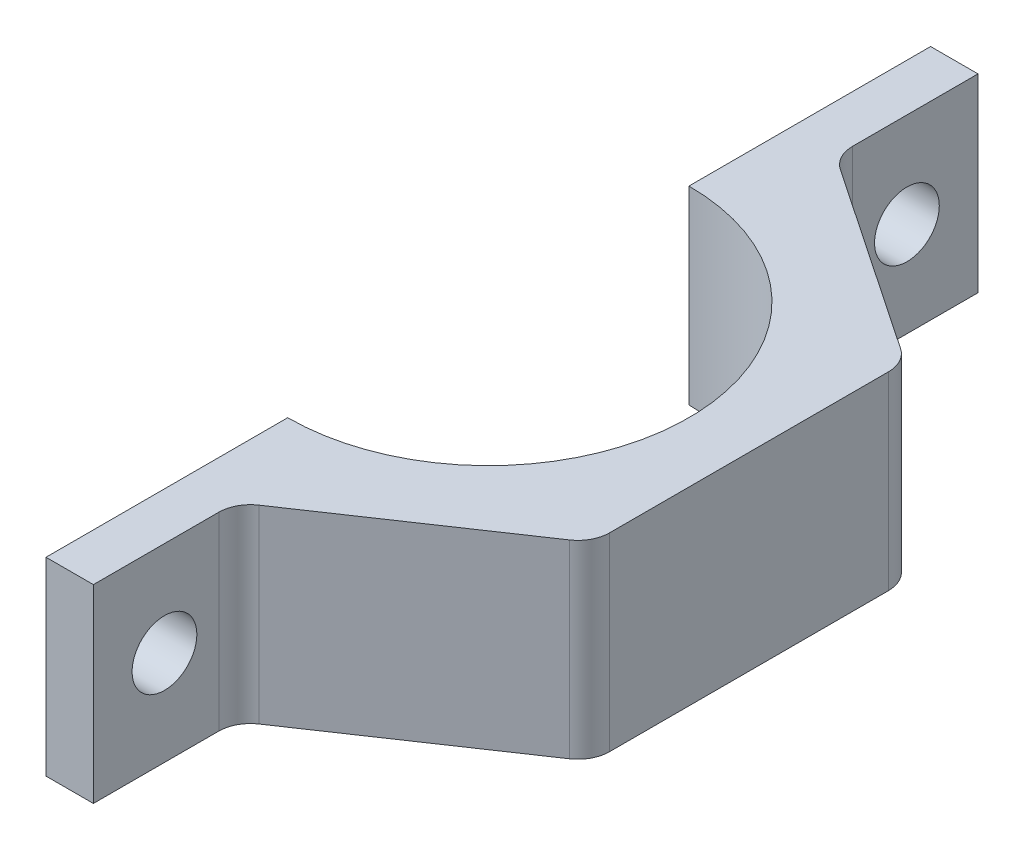
ISO-10303-21;
HEADER;
FILE_DESCRIPTION(('STEP AP214'),'2;1');
FILE_NAME('part.step','',(''),(''),'','','');
FILE_SCHEMA(('AUTOMOTIVE_DESIGN { 1 0 10303 214 1 1 1 1 }'));
ENDSEC;
DATA;
#1=APPLICATION_CONTEXT('core data for automotive mechanical design processes');
#2=APPLICATION_PROTOCOL_DEFINITION('international standard','automotive_design',2000,#1);
#3=PRODUCT_CONTEXT('',#1,'mechanical');
#4=PRODUCT('Part','Part','',(#3));
#5=PRODUCT_RELATED_PRODUCT_CATEGORY('part','',(#4));
#6=PRODUCT_DEFINITION_FORMATION('','',#4);
#7=PRODUCT_DEFINITION_CONTEXT('part definition',#1,'design');
#8=PRODUCT_DEFINITION('design','',#6,#7);
#9=PRODUCT_DEFINITION_SHAPE('','',#8);
#10=(LENGTH_UNIT() NAMED_UNIT(*) SI_UNIT(.MILLI.,.METRE.));
#11=(NAMED_UNIT(*) PLANE_ANGLE_UNIT() SI_UNIT($,.RADIAN.));
#12=(NAMED_UNIT(*) SI_UNIT($,.STERADIAN.) SOLID_ANGLE_UNIT());
#13=UNCERTAINTY_MEASURE_WITH_UNIT(LENGTH_MEASURE(1.E-05),#10,'distance_accuracy_value','');
#14=(GEOMETRIC_REPRESENTATION_CONTEXT(3) GLOBAL_UNCERTAINTY_ASSIGNED_CONTEXT((#13)) GLOBAL_UNIT_ASSIGNED_CONTEXT((#10,
#11,#12)) REPRESENTATION_CONTEXT('',''));
#15=CARTESIAN_POINT('',(0.,0.,0.));
#16=DIRECTION('',(0.,0.,1.));
#17=DIRECTION('',(1.,0.,0.));
#18=AXIS2_PLACEMENT_3D('',#15,#16,#17);
#19=CARTESIAN_POINT('',(0.,12.,0.));
#20=DIRECTION('',(0.,-1.,0.));
#21=DIRECTION('',(0.,0.,-1.));
#22=AXIS2_PLACEMENT_3D('',#19,#20,#21);
#23=CYLINDRICAL_SURFACE('',#22,12.7);
#24=CARTESIAN_POINT('',(0.,0.,0.));
#25=DIRECTION('',(0.,1.,0.));
#26=DIRECTION('',(0.,0.,1.));
#27=AXIS2_PLACEMENT_3D('',#24,#25,#26);
#28=CIRCLE('',#27,12.7);
#29=CARTESIAN_POINT('',(0.,0.,12.7));
#30=VERTEX_POINT('',#29);
#31=CARTESIAN_POINT('',(0.,0.,-12.7));
#32=VERTEX_POINT('',#31);
#33=EDGE_CURVE('E165',#30,#32,#28,.T.);
#34=ORIENTED_EDGE('',*,*,#33,.F.);
#35=DIRECTION('',(0.,-1.,0.));
#36=VECTOR('',#35,1.);
#37=CARTESIAN_POINT('',(0.,12.,12.7));
#38=LINE('',#37,#36);
#39=CARTESIAN_POINT('',(0.,12.,12.7));
#40=VERTEX_POINT('',#39);
#41=EDGE_CURVE('E11',#40,#30,#38,.T.);
#42=ORIENTED_EDGE('',*,*,#41,.F.);
#43=CARTESIAN_POINT('',(0.,12.,0.));
#44=DIRECTION('',(0.,1.,0.));
#45=DIRECTION('',(0.,0.,1.));
#46=AXIS2_PLACEMENT_3D('',#43,#44,#45);
#47=CIRCLE('',#46,12.7);
#48=CARTESIAN_POINT('',(0.,12.,-12.7));
#49=VERTEX_POINT('',#48);
#50=EDGE_CURVE('E200',#40,#49,#47,.T.);
#51=ORIENTED_EDGE('',*,*,#50,.T.);
#52=DIRECTION('',(0.,-1.,0.));
#53=VECTOR('',#52,1.);
#54=CARTESIAN_POINT('',(0.,12.,-12.7));
#55=LINE('',#54,#53);
#56=EDGE_CURVE('E104',#49,#32,#55,.T.);
#57=ORIENTED_EDGE('',*,*,#56,.T.);
#58=EDGE_LOOP('',(#34,#42,#51,#57));
#59=FACE_BOUND('',#58,.T.);
#60=ADVANCED_FACE('F35',(#59),#23,.F.);
#61=CARTESIAN_POINT('',(0.,12.,0.));
#62=DIRECTION('',(1.,0.,0.));
#63=DIRECTION('',(0.,0.,-1.));
#64=AXIS2_PLACEMENT_3D('',#61,#62,#63);
#65=PLANE('',#64);
#66=CARTESIAN_POINT('',(0.,6.,23.5));
#67=DIRECTION('',(1.,0.,0.));
#68=DIRECTION('',(0.,0.,-1.));
#69=AXIS2_PLACEMENT_3D('',#66,#67,#68);
#70=CIRCLE('',#69,2.05);
#71=CARTESIAN_POINT('',(0.,6.,21.45));
#72=VERTEX_POINT('',#71);
#73=EDGE_CURVE('E169',#72,#72,#70,.T.);
#74=ORIENTED_EDGE('',*,*,#73,.T.);
#75=EDGE_LOOP('',(#74));
#76=FACE_BOUND('',#75,.T.);
#77=DIRECTION('',(0.,0.,1.));
#78=VECTOR('',#77,1.);
#79=CARTESIAN_POINT('',(0.,0.,0.));
#80=LINE('',#79,#78);
#81=CARTESIAN_POINT('',(0.,0.,28.));
#82=VERTEX_POINT('',#81);
#83=EDGE_CURVE('E168',#30,#82,#80,.T.);
#84=ORIENTED_EDGE('',*,*,#83,.T.);
#85=DIRECTION('',(0.,-1.,0.));
#86=VECTOR('',#85,1.);
#87=CARTESIAN_POINT('',(0.,12.,28.));
#88=LINE('',#87,#86);
#89=CARTESIAN_POINT('',(0.,12.,28.));
#90=VERTEX_POINT('',#89);
#91=EDGE_CURVE('E44',#90,#82,#88,.T.);
#92=ORIENTED_EDGE('',*,*,#91,.F.);
#93=DIRECTION('',(0.,0.,1.));
#94=VECTOR('',#93,1.);
#95=CARTESIAN_POINT('',(0.,12.,0.));
#96=LINE('',#95,#94);
#97=EDGE_CURVE('E270',#40,#90,#96,.T.);
#98=ORIENTED_EDGE('',*,*,#97,.F.);
#99=ORIENTED_EDGE('',*,*,#41,.T.);
#100=EDGE_LOOP('',(#84,#92,#98,#99));
#101=FACE_BOUND('',#100,.T.);
#102=ADVANCED_FACE('F275',(#76,#101),#65,.F.);
#103=CARTESIAN_POINT('',(0.,12.,28.));
#104=DIRECTION('',(0.,0.,-1.));
#105=DIRECTION('',(-1.,0.,0.));
#106=AXIS2_PLACEMENT_3D('',#103,#104,#105);
#107=PLANE('',#106);
#108=DIRECTION('',(1.,0.,0.));
#109=VECTOR('',#108,1.);
#110=CARTESIAN_POINT('',(0.,0.,28.));
#111=LINE('',#110,#109);
#112=CARTESIAN_POINT('',(2.99999999999999,0.,28.));
#113=VERTEX_POINT('',#112);
#114=EDGE_CURVE('E171',#82,#113,#111,.T.);
#115=ORIENTED_EDGE('',*,*,#114,.T.);
#116=DIRECTION('',(0.,-1.,0.));
#117=VECTOR('',#116,1.);
#118=CARTESIAN_POINT('',(2.99999999999999,12.,28.));
#119=LINE('',#118,#117);
#120=CARTESIAN_POINT('',(2.99999999999999,12.,28.));
#121=VERTEX_POINT('',#120);
#122=EDGE_CURVE('E220',#121,#113,#119,.T.);
#123=ORIENTED_EDGE('',*,*,#122,.F.);
#124=DIRECTION('',(1.,0.,0.));
#125=VECTOR('',#124,1.);
#126=CARTESIAN_POINT('',(0.,12.,28.));
#127=LINE('',#126,#125);
#128=EDGE_CURVE('E230',#90,#121,#127,.T.);
#129=ORIENTED_EDGE('',*,*,#128,.F.);
#130=ORIENTED_EDGE('',*,*,#91,.T.);
#131=EDGE_LOOP('',(#115,#123,#129,#130));
#132=FACE_BOUND('',#131,.T.);
#133=ADVANCED_FACE('F228',(#132),#107,.F.);
#134=CARTESIAN_POINT('',(2.99999999999999,12.,0.));
#135=DIRECTION('',(-1.,0.,0.));
#136=DIRECTION('',(0.,0.,1.));
#137=AXIS2_PLACEMENT_3D('',#134,#135,#136);
#138=PLANE('',#137);
#139=CARTESIAN_POINT('',(3.,6.,23.5));
#140=DIRECTION('',(1.,0.,0.));
#141=DIRECTION('',(0.,0.,1.));
#142=AXIS2_PLACEMENT_3D('',#139,#140,#141);
#143=CIRCLE('',#142,2.05);
#144=CARTESIAN_POINT('',(3.,6.,25.55));
#145=VERTEX_POINT('',#144);
#146=EDGE_CURVE('E339',#145,#145,#143,.T.);
#147=ORIENTED_EDGE('',*,*,#146,.F.);
#148=EDGE_LOOP('',(#147));
#149=FACE_BOUND('',#148,.T.);
#150=DIRECTION('',(0.,0.,-1.));
#151=VECTOR('',#150,1.);
#152=CARTESIAN_POINT('',(2.99999999999999,0.,0.));
#153=LINE('',#152,#151);
#154=CARTESIAN_POINT('',(2.99999999999999,0.,20.0629290839179));
#155=VERTEX_POINT('',#154);
#156=EDGE_CURVE('E173',#113,#155,#153,.T.);
#157=ORIENTED_EDGE('',*,*,#156,.T.);
#158=DIRECTION('',(0.,-1.,0.));
#159=VECTOR('',#158,1.);
#160=CARTESIAN_POINT('',(2.99999999999999,12.,20.0629290839179));
#161=LINE('',#160,#159);
#162=CARTESIAN_POINT('',(2.99999999999999,12.,20.0629290839179));
#163=VERTEX_POINT('',#162);
#164=EDGE_CURVE('E217',#163,#155,#161,.T.);
#165=ORIENTED_EDGE('',*,*,#164,.F.);
#166=DIRECTION('',(0.,0.,-1.));
#167=VECTOR('',#166,1.);
#168=CARTESIAN_POINT('',(2.99999999999999,12.,0.));
#169=LINE('',#168,#167);
#170=EDGE_CURVE('E249',#121,#163,#169,.T.);
#171=ORIENTED_EDGE('',*,*,#170,.F.);
#172=ORIENTED_EDGE('',*,*,#122,.T.);
#173=EDGE_LOOP('',(#157,#165,#171,#172));
#174=FACE_BOUND('',#173,.T.);
#175=ADVANCED_FACE('F239',(#149,#174),#138,.F.);
#176=CARTESIAN_POINT('',(4.99999999999999,12.,20.0629290839179));
#177=DIRECTION('',(0.,-1.,0.));
#178=DIRECTION('',(0.,0.,-1.));
#179=AXIS2_PLACEMENT_3D('',#176,#177,#178);
#180=CYLINDRICAL_SURFACE('',#179,2.);
#181=CARTESIAN_POINT('',(4.99999999999999,0.,20.0629290839179));
#182=DIRECTION('',(0.,1.,0.));
#183=DIRECTION('',(0.,0.,1.));
#184=AXIS2_PLACEMENT_3D('',#181,#182,#183);
#185=CIRCLE('',#184,2.);
#186=CARTESIAN_POINT('',(3.88098110704418,0.,18.4052811366118));
#187=VERTEX_POINT('',#186);
#188=EDGE_CURVE('E175',#155,#187,#185,.F.);
#189=ORIENTED_EDGE('',*,*,#188,.T.);
#190=DIRECTION('',(0.,-1.,0.));
#191=VECTOR('',#190,1.);
#192=CARTESIAN_POINT('',(3.88098110704418,12.,18.4052811366118));
#193=LINE('',#192,#191);
#194=CARTESIAN_POINT('',(3.88098110704418,12.,18.4052811366118));
#195=VERTEX_POINT('',#194);
#196=EDGE_CURVE('E215',#195,#187,#193,.T.);
#197=ORIENTED_EDGE('',*,*,#196,.F.);
#198=CARTESIAN_POINT('',(4.99999999999999,12.,20.0629290839179));
#199=DIRECTION('',(0.,1.,0.));
#200=DIRECTION('',(0.,0.,1.));
#201=AXIS2_PLACEMENT_3D('',#198,#199,#200);
#202=CIRCLE('',#201,2.);
#203=EDGE_CURVE('E245',#163,#195,#202,.F.);
#204=ORIENTED_EDGE('',*,*,#203,.F.);
#205=ORIENTED_EDGE('',*,*,#164,.T.);
#206=EDGE_LOOP('',(#189,#197,#204,#205));
#207=FACE_BOUND('',#206,.T.);
#208=ADVANCED_FACE('F243',(#207),#180,.F.);
#209=CARTESIAN_POINT('',(9.75011447389231,12.,14.4432389349163));
#210=DIRECTION('',(0.559509446477911,0.,0.82882397365302));
#211=DIRECTION('',(0.82882397365302,0.,-0.559509446477911));
#212=AXIS2_PLACEMENT_3D('',#209,#210,#211);
#213=PLANE('',#212);
#214=DIRECTION('',(-0.82882397365302,0.,0.559509446477911));
#215=VECTOR('',#214,1.);
#216=CARTESIAN_POINT('',(9.75011447389231,0.,14.4432389349163));
#217=LINE('',#216,#215);
#218=CARTESIAN_POINT('',(15.6192478407404,0.,10.4811967332208));
#219=VERTEX_POINT('',#218);
#220=EDGE_CURVE('E178',#219,#187,#217,.T.);
#221=ORIENTED_EDGE('',*,*,#220,.F.);
#222=DIRECTION('',(0.,-1.,0.));
#223=VECTOR('',#222,1.);
#224=CARTESIAN_POINT('',(15.6192478407404,12.,10.4811967332208));
#225=LINE('',#224,#223);
#226=CARTESIAN_POINT('',(15.6192478407404,12.,10.4811967332208));
#227=VERTEX_POINT('',#226);
#228=EDGE_CURVE('E213',#227,#219,#225,.T.);
#229=ORIENTED_EDGE('',*,*,#228,.F.);
#230=DIRECTION('',(-0.82882397365302,0.,0.559509446477911));
#231=VECTOR('',#230,1.);
#232=CARTESIAN_POINT('',(9.75011447389231,12.,14.4432389349163));
#233=LINE('',#232,#231);
#234=EDGE_CURVE('E248',#227,#195,#233,.T.);
#235=ORIENTED_EDGE('',*,*,#234,.T.);
#236=ORIENTED_EDGE('',*,*,#196,.T.);
#237=EDGE_LOOP('',(#221,#229,#235,#236));
#238=FACE_BOUND('',#237,.T.);
#239=ADVANCED_FACE('F290',(#238),#213,.T.);
#240=CARTESIAN_POINT('',(14.5002289477846,12.,8.82354878591476));
#241=DIRECTION('',(0.,-1.,0.));
#242=DIRECTION('',(0.,0.,-1.));
#243=AXIS2_PLACEMENT_3D('',#240,#241,#242);
#244=CYLINDRICAL_SURFACE('',#243,2.);
#245=CARTESIAN_POINT('',(14.5002289477846,0.,8.82354878591476));
#246=DIRECTION('',(0.,1.,0.));
#247=DIRECTION('',(0.,0.,1.));
#248=AXIS2_PLACEMENT_3D('',#245,#246,#247);
#249=CIRCLE('',#248,2.);
#250=CARTESIAN_POINT('',(16.5002289477846,0.,8.82354878591475));
#251=VERTEX_POINT('',#250);
#252=EDGE_CURVE('E181',#251,#219,#249,.F.);
#253=ORIENTED_EDGE('',*,*,#252,.F.);
#254=DIRECTION('',(0.,-1.,0.));
#255=VECTOR('',#254,1.);
#256=CARTESIAN_POINT('',(16.5002289477846,12.,8.82354878591475));
#257=LINE('',#256,#255);
#258=CARTESIAN_POINT('',(16.5002289477846,12.,8.82354878591475));
#259=VERTEX_POINT('',#258);
#260=EDGE_CURVE('E211',#259,#251,#257,.T.);
#261=ORIENTED_EDGE('',*,*,#260,.F.);
#262=CARTESIAN_POINT('',(14.5002289477846,12.,8.82354878591476));
#263=DIRECTION('',(0.,1.,0.));
#264=DIRECTION('',(0.,0.,1.));
#265=AXIS2_PLACEMENT_3D('',#262,#263,#264);
#266=CIRCLE('',#265,2.);
#267=EDGE_CURVE('E251',#259,#227,#266,.F.);
#268=ORIENTED_EDGE('',*,*,#267,.T.);
#269=ORIENTED_EDGE('',*,*,#228,.T.);
#270=EDGE_LOOP('',(#253,#261,#268,#269));
#271=FACE_BOUND('',#270,.T.);
#272=ADVANCED_FACE('F293',(#271),#244,.T.);
#273=CARTESIAN_POINT('',(16.5002289477846,12.,0.));
#274=DIRECTION('',(1.,0.,0.));
#275=DIRECTION('',(0.,0.,-1.));
#276=AXIS2_PLACEMENT_3D('',#273,#274,#275);
#277=PLANE('',#276);
#278=DIRECTION('',(0.,0.,1.));
#279=VECTOR('',#278,1.);
#280=CARTESIAN_POINT('',(16.5002289477846,0.,0.));
#281=LINE('',#280,#279);
#282=CARTESIAN_POINT('',(16.5002289477846,0.,-8.82354878591475));
#283=VERTEX_POINT('',#282);
#284=EDGE_CURVE('E184',#283,#251,#281,.T.);
#285=ORIENTED_EDGE('',*,*,#284,.F.);
#286=DIRECTION('',(0.,-1.,0.));
#287=VECTOR('',#286,1.);
#288=CARTESIAN_POINT('',(16.5002289477846,12.,-8.82354878591475));
#289=LINE('',#288,#287);
#290=CARTESIAN_POINT('',(16.5002289477846,12.,-8.82354878591475));
#291=VERTEX_POINT('',#290);
#292=EDGE_CURVE('E209',#291,#283,#289,.T.);
#293=ORIENTED_EDGE('',*,*,#292,.F.);
#294=DIRECTION('',(0.,0.,1.));
#295=VECTOR('',#294,1.);
#296=CARTESIAN_POINT('',(16.5002289477846,12.,0.));
#297=LINE('',#296,#295);
#298=EDGE_CURVE('E258',#291,#259,#297,.T.);
#299=ORIENTED_EDGE('',*,*,#298,.T.);
#300=ORIENTED_EDGE('',*,*,#260,.T.);
#301=EDGE_LOOP('',(#285,#293,#299,#300));
#302=FACE_BOUND('',#301,.T.);
#303=ADVANCED_FACE('F297',(#302),#277,.T.);
#304=CARTESIAN_POINT('',(14.5002289477846,12.,-8.82354878591476));
#305=DIRECTION('',(0.,-1.,0.));
#306=DIRECTION('',(0.,0.,-1.));
#307=AXIS2_PLACEMENT_3D('',#304,#305,#306);
#308=CYLINDRICAL_SURFACE('',#307,2.);
#309=CARTESIAN_POINT('',(14.5002289477846,0.,-8.82354878591476));
#310=DIRECTION('',(0.,1.,0.));
#311=DIRECTION('',(0.,0.,1.));
#312=AXIS2_PLACEMENT_3D('',#309,#310,#311);
#313=CIRCLE('',#312,2.);
#314=CARTESIAN_POINT('',(15.6192478407404,0.,-10.4811967332208));
#315=VERTEX_POINT('',#314);
#316=EDGE_CURVE('E187',#283,#315,#313,.T.);
#317=ORIENTED_EDGE('',*,*,#316,.T.);
#318=DIRECTION('',(0.,-1.,0.));
#319=VECTOR('',#318,1.);
#320=CARTESIAN_POINT('',(15.6192478407404,12.,-10.4811967332208));
#321=LINE('',#320,#319);
#322=CARTESIAN_POINT('',(15.6192478407404,12.,-10.4811967332208));
#323=VERTEX_POINT('',#322);
#324=EDGE_CURVE('E206',#323,#315,#321,.T.);
#325=ORIENTED_EDGE('',*,*,#324,.F.);
#326=CARTESIAN_POINT('',(14.5002289477846,12.,-8.82354878591476));
#327=DIRECTION('',(0.,1.,0.));
#328=DIRECTION('',(0.,0.,1.));
#329=AXIS2_PLACEMENT_3D('',#326,#327,#328);
#330=CIRCLE('',#329,2.);
#331=EDGE_CURVE('E261',#291,#323,#330,.T.);
#332=ORIENTED_EDGE('',*,*,#331,.F.);
#333=ORIENTED_EDGE('',*,*,#292,.T.);
#334=EDGE_LOOP('',(#317,#325,#332,#333));
#335=FACE_BOUND('',#334,.T.);
#336=ADVANCED_FACE('F301',(#335),#308,.T.);
#337=CARTESIAN_POINT('',(9.75011447389231,12.,-14.4432389349163));
#338=DIRECTION('',(-0.559509446477911,0.,0.82882397365302));
#339=DIRECTION('',(0.82882397365302,0.,0.559509446477911));
#340=AXIS2_PLACEMENT_3D('',#337,#338,#339);
#341=PLANE('',#340);
#342=DIRECTION('',(-0.82882397365302,0.,-0.559509446477911));
#343=VECTOR('',#342,1.);
#344=CARTESIAN_POINT('',(9.75011447389231,0.,-14.4432389349163));
#345=LINE('',#344,#343);
#346=CARTESIAN_POINT('',(3.88098110704418,0.,-18.4052811366118));
#347=VERTEX_POINT('',#346);
#348=EDGE_CURVE('E189',#315,#347,#345,.T.);
#349=ORIENTED_EDGE('',*,*,#348,.T.);
#350=DIRECTION('',(0.,-1.,0.));
#351=VECTOR('',#350,1.);
#352=CARTESIAN_POINT('',(3.88098110704418,12.,-18.4052811366118));
#353=LINE('',#352,#351);
#354=CARTESIAN_POINT('',(3.88098110704418,12.,-18.4052811366118));
#355=VERTEX_POINT('',#354);
#356=EDGE_CURVE('E204',#355,#347,#353,.T.);
#357=ORIENTED_EDGE('',*,*,#356,.F.);
#358=DIRECTION('',(-0.82882397365302,0.,-0.559509446477911));
#359=VECTOR('',#358,1.);
#360=CARTESIAN_POINT('',(9.75011447389231,12.,-14.4432389349163));
#361=LINE('',#360,#359);
#362=EDGE_CURVE('E263',#323,#355,#361,.T.);
#363=ORIENTED_EDGE('',*,*,#362,.F.);
#364=ORIENTED_EDGE('',*,*,#324,.T.);
#365=EDGE_LOOP('',(#349,#357,#363,#364));
#366=FACE_BOUND('',#365,.T.);
#367=ADVANCED_FACE('F305',(#366),#341,.F.);
#368=CARTESIAN_POINT('',(4.99999999999999,12.,-20.0629290839179));
#369=DIRECTION('',(0.,-1.,0.));
#370=DIRECTION('',(0.,0.,-1.));
#371=AXIS2_PLACEMENT_3D('',#368,#369,#370);
#372=CYLINDRICAL_SURFACE('',#371,2.);
#373=CARTESIAN_POINT('',(4.99999999999999,0.,-20.0629290839179));
#374=DIRECTION('',(0.,1.,0.));
#375=DIRECTION('',(0.,0.,1.));
#376=AXIS2_PLACEMENT_3D('',#373,#374,#375);
#377=CIRCLE('',#376,2.);
#378=CARTESIAN_POINT('',(2.99999999999999,0.,-20.0629290839179));
#379=VERTEX_POINT('',#378);
#380=EDGE_CURVE('E192',#379,#347,#377,.T.);
#381=ORIENTED_EDGE('',*,*,#380,.F.);
#382=DIRECTION('',(0.,-1.,0.));
#383=VECTOR('',#382,1.);
#384=CARTESIAN_POINT('',(2.99999999999999,12.,-20.0629290839179));
#385=LINE('',#384,#383);
#386=CARTESIAN_POINT('',(2.99999999999999,12.,-20.0629290839179));
#387=VERTEX_POINT('',#386);
#388=EDGE_CURVE('E152',#387,#379,#385,.T.);
#389=ORIENTED_EDGE('',*,*,#388,.F.);
#390=CARTESIAN_POINT('',(4.99999999999999,12.,-20.0629290839179));
#391=DIRECTION('',(0.,1.,0.));
#392=DIRECTION('',(0.,0.,1.));
#393=AXIS2_PLACEMENT_3D('',#390,#391,#392);
#394=CIRCLE('',#393,2.);
#395=EDGE_CURVE('E158',#387,#355,#394,.T.);
#396=ORIENTED_EDGE('',*,*,#395,.T.);
#397=ORIENTED_EDGE('',*,*,#356,.T.);
#398=EDGE_LOOP('',(#381,#389,#396,#397));
#399=FACE_BOUND('',#398,.T.);
#400=ADVANCED_FACE('F266',(#399),#372,.F.);
#401=CARTESIAN_POINT('',(2.99999999999999,12.,0.));
#402=DIRECTION('',(1.,0.,0.));
#403=DIRECTION('',(0.,0.,-1.));
#404=AXIS2_PLACEMENT_3D('',#401,#402,#403);
#405=PLANE('',#404);
#406=CARTESIAN_POINT('',(2.99999999999999,6.,-23.5));
#407=DIRECTION('',(1.,0.,0.));
#408=DIRECTION('',(0.,0.,-1.));
#409=AXIS2_PLACEMENT_3D('',#406,#407,#408);
#410=CIRCLE('',#409,2.05);
#411=CARTESIAN_POINT('',(2.99999999999999,6.,-25.55));
#412=VERTEX_POINT('',#411);
#413=EDGE_CURVE('E336',#412,#412,#410,.T.);
#414=ORIENTED_EDGE('',*,*,#413,.F.);
#415=EDGE_LOOP('',(#414));
#416=FACE_BOUND('',#415,.T.);
#417=DIRECTION('',(0.,0.,1.));
#418=VECTOR('',#417,1.);
#419=CARTESIAN_POINT('',(2.99999999999999,0.,0.));
#420=LINE('',#419,#418);
#421=CARTESIAN_POINT('',(2.99999999999999,0.,-28.));
#422=VERTEX_POINT('',#421);
#423=EDGE_CURVE('E147',#422,#379,#420,.T.);
#424=ORIENTED_EDGE('',*,*,#423,.F.);
#425=DIRECTION('',(0.,-1.,0.));
#426=VECTOR('',#425,1.);
#427=CARTESIAN_POINT('',(2.99999999999999,12.,-28.));
#428=LINE('',#427,#426);
#429=CARTESIAN_POINT('',(2.99999999999999,12.,-28.));
#430=VERTEX_POINT('',#429);
#431=EDGE_CURVE('E142',#430,#422,#428,.T.);
#432=ORIENTED_EDGE('',*,*,#431,.F.);
#433=DIRECTION('',(0.,0.,1.));
#434=VECTOR('',#433,1.);
#435=CARTESIAN_POINT('',(2.99999999999999,12.,0.));
#436=LINE('',#435,#434);
#437=EDGE_CURVE('E145',#430,#387,#436,.T.);
#438=ORIENTED_EDGE('',*,*,#437,.T.);
#439=ORIENTED_EDGE('',*,*,#388,.T.);
#440=EDGE_LOOP('',(#424,#432,#438,#439));
#441=FACE_BOUND('',#440,.T.);
#442=ADVANCED_FACE('F144',(#416,#441),#405,.T.);
#443=CARTESIAN_POINT('',(0.,12.,-28.));
#444=DIRECTION('',(0.,0.,-1.));
#445=DIRECTION('',(-1.,0.,0.));
#446=AXIS2_PLACEMENT_3D('',#443,#444,#445);
#447=PLANE('',#446);
#448=DIRECTION('',(1.,0.,0.));
#449=VECTOR('',#448,1.);
#450=CARTESIAN_POINT('',(0.,0.,-28.));
#451=LINE('',#450,#449);
#452=CARTESIAN_POINT('',(0.,0.,-28.));
#453=VERTEX_POINT('',#452);
#454=EDGE_CURVE('E196',#453,#422,#451,.T.);
#455=ORIENTED_EDGE('',*,*,#454,.F.);
#456=DIRECTION('',(0.,-1.,0.));
#457=VECTOR('',#456,1.);
#458=CARTESIAN_POINT('',(0.,12.,-28.));
#459=LINE('',#458,#457);
#460=CARTESIAN_POINT('',(0.,12.,-28.));
#461=VERTEX_POINT('',#460);
#462=EDGE_CURVE('E97',#461,#453,#459,.T.);
#463=ORIENTED_EDGE('',*,*,#462,.F.);
#464=DIRECTION('',(1.,0.,0.));
#465=VECTOR('',#464,1.);
#466=CARTESIAN_POINT('',(0.,12.,-28.));
#467=LINE('',#466,#465);
#468=EDGE_CURVE('E156',#461,#430,#467,.T.);
#469=ORIENTED_EDGE('',*,*,#468,.T.);
#470=ORIENTED_EDGE('',*,*,#431,.T.);
#471=EDGE_LOOP('',(#455,#463,#469,#470));
#472=FACE_BOUND('',#471,.T.);
#473=ADVANCED_FACE('F160',(#472),#447,.T.);
#474=CARTESIAN_POINT('',(0.,12.,0.));
#475=DIRECTION('',(1.,0.,0.));
#476=DIRECTION('',(0.,0.,-1.));
#477=AXIS2_PLACEMENT_3D('',#474,#475,#476);
#478=PLANE('',#477);
#479=CARTESIAN_POINT('',(0.,6.,-23.5));
#480=DIRECTION('',(1.,0.,0.));
#481=DIRECTION('',(0.,0.,-1.));
#482=AXIS2_PLACEMENT_3D('',#479,#480,#481);
#483=CIRCLE('',#482,2.05);
#484=CARTESIAN_POINT('',(0.,6.,-25.55));
#485=VERTEX_POINT('',#484);
#486=EDGE_CURVE('E38',#485,#485,#483,.T.);
#487=ORIENTED_EDGE('',*,*,#486,.T.);
#488=EDGE_LOOP('',(#487));
#489=FACE_BOUND('',#488,.T.);
#490=DIRECTION('',(0.,0.,1.));
#491=VECTOR('',#490,1.);
#492=CARTESIAN_POINT('',(0.,0.,0.));
#493=LINE('',#492,#491);
#494=EDGE_CURVE('E198',#453,#32,#493,.T.);
#495=ORIENTED_EDGE('',*,*,#494,.T.);
#496=ORIENTED_EDGE('',*,*,#56,.F.);
#497=DIRECTION('',(0.,0.,1.));
#498=VECTOR('',#497,1.);
#499=CARTESIAN_POINT('',(0.,12.,0.));
#500=LINE('',#499,#498);
#501=EDGE_CURVE('E52',#461,#49,#500,.T.);
#502=ORIENTED_EDGE('',*,*,#501,.F.);
#503=ORIENTED_EDGE('',*,*,#462,.T.);
#504=EDGE_LOOP('',(#495,#496,#502,#503));
#505=FACE_BOUND('',#504,.T.);
#506=ADVANCED_FACE('F269',(#489,#505),#478,.F.);
#507=CARTESIAN_POINT('',(0.,12.,0.));
#508=DIRECTION('',(0.,1.,0.));
#509=DIRECTION('',(0.,0.,1.));
#510=AXIS2_PLACEMENT_3D('',#507,#508,#509);
#511=PLANE('',#510);
#512=ORIENTED_EDGE('',*,*,#50,.F.);
#513=ORIENTED_EDGE('',*,*,#97,.T.);
#514=ORIENTED_EDGE('',*,*,#128,.T.);
#515=ORIENTED_EDGE('',*,*,#170,.T.);
#516=ORIENTED_EDGE('',*,*,#203,.T.);
#517=ORIENTED_EDGE('',*,*,#234,.F.);
#518=ORIENTED_EDGE('',*,*,#267,.F.);
#519=ORIENTED_EDGE('',*,*,#298,.F.);
#520=ORIENTED_EDGE('',*,*,#331,.T.);
#521=ORIENTED_EDGE('',*,*,#362,.T.);
#522=ORIENTED_EDGE('',*,*,#395,.F.);
#523=ORIENTED_EDGE('',*,*,#437,.F.);
#524=ORIENTED_EDGE('',*,*,#468,.F.);
#525=ORIENTED_EDGE('',*,*,#501,.T.);
#526=EDGE_LOOP('',(#512,#513,#514,#515,#516,#517,#518,#519,#520,#521,#522,#523,#524,#525));
#527=FACE_BOUND('',#526,.T.);
#528=ADVANCED_FACE('F155',(#527),#511,.T.);
#529=CARTESIAN_POINT('',(0.,0.,0.));
#530=DIRECTION('',(0.,1.,0.));
#531=DIRECTION('',(0.,0.,1.));
#532=AXIS2_PLACEMENT_3D('',#529,#530,#531);
#533=PLANE('',#532);
#534=ORIENTED_EDGE('',*,*,#33,.T.);
#535=ORIENTED_EDGE('',*,*,#494,.F.);
#536=ORIENTED_EDGE('',*,*,#454,.T.);
#537=ORIENTED_EDGE('',*,*,#423,.T.);
#538=ORIENTED_EDGE('',*,*,#380,.T.);
#539=ORIENTED_EDGE('',*,*,#348,.F.);
#540=ORIENTED_EDGE('',*,*,#316,.F.);
#541=ORIENTED_EDGE('',*,*,#284,.T.);
#542=ORIENTED_EDGE('',*,*,#252,.T.);
#543=ORIENTED_EDGE('',*,*,#220,.T.);
#544=ORIENTED_EDGE('',*,*,#188,.F.);
#545=ORIENTED_EDGE('',*,*,#156,.F.);
#546=ORIENTED_EDGE('',*,*,#114,.F.);
#547=ORIENTED_EDGE('',*,*,#83,.F.);
#548=EDGE_LOOP('',(#534,#535,#536,#537,#538,#539,#540,#541,#542,#543,#544,#545,#546,#547));
#549=FACE_BOUND('',#548,.T.);
#550=ADVANCED_FACE('F235',(#549),#533,.F.);
#551=CARTESIAN_POINT('',(-9.00000000000001,6.,-23.5));
#552=DIRECTION('',(1.,0.,0.));
#553=DIRECTION('',(0.,0.,-1.));
#554=AXIS2_PLACEMENT_3D('',#551,#552,#553);
#555=CYLINDRICAL_SURFACE('',#554,2.05);
#556=ORIENTED_EDGE('',*,*,#413,.T.);
#557=EDGE_LOOP('',(#556));
#558=FACE_BOUND('',#557,.T.);
#559=ORIENTED_EDGE('',*,*,#486,.F.);
#560=EDGE_LOOP('',(#559));
#561=FACE_BOUND('',#560,.T.);
#562=ADVANCED_FACE('F322',(#558,#561),#555,.F.);
#563=CARTESIAN_POINT('',(-9.,6.,23.5));
#564=DIRECTION('',(1.,0.,0.));
#565=DIRECTION('',(0.,0.,-1.));
#566=AXIS2_PLACEMENT_3D('',#563,#564,#565);
#567=CYLINDRICAL_SURFACE('',#566,2.05);
#568=ORIENTED_EDGE('',*,*,#146,.T.);
#569=EDGE_LOOP('',(#568));
#570=FACE_BOUND('',#569,.T.);
#571=ORIENTED_EDGE('',*,*,#73,.F.);
#572=EDGE_LOOP('',(#571));
#573=FACE_BOUND('',#572,.T.);
#574=ADVANCED_FACE('F325',(#570,#573),#567,.F.);
#575=CLOSED_SHELL('',(#60,#102,#133,#175,#208,#239,#272,#303,#336,#367,#400,#442,#473,#506,#528,
#550,#562,#574));
#576=MANIFOLD_SOLID_BREP('B2',#575);
#577=ADVANCED_BREP_SHAPE_REPRESENTATION('',(#18,#576),#14);
#578=SHAPE_DEFINITION_REPRESENTATION(#9,#577);
ENDSEC;
END-ISO-10303-21;
